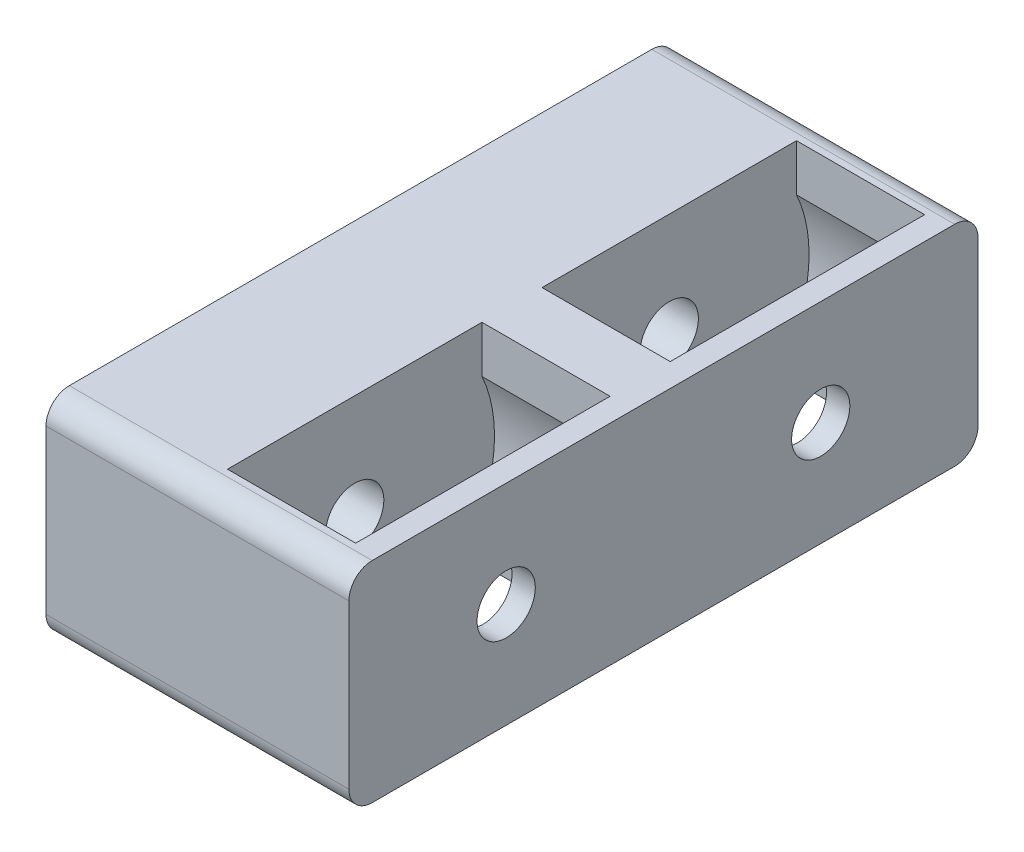
ISO-10303-21;
HEADER;
FILE_DESCRIPTION(('STEP AP214'),'2;1');
FILE_NAME('part.step','',(''),(''),'','','');
FILE_SCHEMA(('AUTOMOTIVE_DESIGN { 1 0 10303 214 1 1 1 1 }'));
ENDSEC;
DATA;
#1=APPLICATION_CONTEXT('core data for automotive mechanical design processes');
#2=APPLICATION_PROTOCOL_DEFINITION('international standard','automotive_design',2000,#1);
#3=PRODUCT_CONTEXT('',#1,'mechanical');
#4=PRODUCT('Part','Part','',(#3));
#5=PRODUCT_RELATED_PRODUCT_CATEGORY('part','',(#4));
#6=PRODUCT_DEFINITION_FORMATION('','',#4);
#7=PRODUCT_DEFINITION_CONTEXT('part definition',#1,'design');
#8=PRODUCT_DEFINITION('design','',#6,#7);
#9=PRODUCT_DEFINITION_SHAPE('','',#8);
#10=(LENGTH_UNIT() NAMED_UNIT(*) SI_UNIT(.MILLI.,.METRE.));
#11=(NAMED_UNIT(*) PLANE_ANGLE_UNIT() SI_UNIT($,.RADIAN.));
#12=(NAMED_UNIT(*) SI_UNIT($,.STERADIAN.) SOLID_ANGLE_UNIT());
#13=UNCERTAINTY_MEASURE_WITH_UNIT(LENGTH_MEASURE(1.E-05),#10,'distance_accuracy_value','');
#14=(GEOMETRIC_REPRESENTATION_CONTEXT(3) GLOBAL_UNCERTAINTY_ASSIGNED_CONTEXT((#13)) GLOBAL_UNIT_ASSIGNED_CONTEXT((#10,
#11,#12)) REPRESENTATION_CONTEXT('',''));
#15=CARTESIAN_POINT('',(0.,0.,0.));
#16=DIRECTION('',(0.,0.,1.));
#17=DIRECTION('',(1.,0.,0.));
#18=AXIS2_PLACEMENT_3D('',#15,#16,#17);
#19=CARTESIAN_POINT('',(24.,0.,13.5));
#20=DIRECTION('',(-1.,0.,0.));
#21=DIRECTION('',(0.,0.,1.));
#22=AXIS2_PLACEMENT_3D('',#19,#20,#21);
#23=CYLINDRICAL_SURFACE('',#22,2.5);
#24=CARTESIAN_POINT('',(0.,0.,13.5));
#25=DIRECTION('',(1.,0.,0.));
#26=DIRECTION('',(0.,0.,-1.));
#27=AXIS2_PLACEMENT_3D('',#24,#25,#26);
#28=CIRCLE('',#27,2.5);
#29=CARTESIAN_POINT('',(0.,0.,11.));
#30=VERTEX_POINT('',#29);
#31=EDGE_CURVE('E376',#30,#30,#28,.T.);
#32=ORIENTED_EDGE('',*,*,#31,.F.);
#33=EDGE_LOOP('',(#32));
#34=FACE_BOUND('',#33,.T.);
#35=CARTESIAN_POINT('',(13.,0.,13.5));
#36=DIRECTION('',(1.,0.,0.));
#37=DIRECTION('',(0.,0.,-1.));
#38=AXIS2_PLACEMENT_3D('',#35,#36,#37);
#39=CIRCLE('',#38,2.5);
#40=CARTESIAN_POINT('',(13.,0.,11.));
#41=VERTEX_POINT('',#40);
#42=EDGE_CURVE('E37',#41,#41,#39,.T.);
#43=ORIENTED_EDGE('',*,*,#42,.T.);
#44=EDGE_LOOP('',(#43));
#45=FACE_BOUND('',#44,.T.);
#46=ADVANCED_FACE('F33',(#34,#45),#23,.F.);
#47=CARTESIAN_POINT('',(24.,0.,-13.5));
#48=DIRECTION('',(-1.,0.,0.));
#49=DIRECTION('',(0.,0.,1.));
#50=AXIS2_PLACEMENT_3D('',#47,#48,#49);
#51=CYLINDRICAL_SURFACE('',#50,2.5);
#52=CARTESIAN_POINT('',(0.,0.,-13.5));
#53=DIRECTION('',(1.,0.,0.));
#54=DIRECTION('',(0.,0.,-1.));
#55=AXIS2_PLACEMENT_3D('',#52,#53,#54);
#56=CIRCLE('',#55,2.5);
#57=CARTESIAN_POINT('',(0.,0.,-16.));
#58=VERTEX_POINT('',#57);
#59=EDGE_CURVE('E373',#58,#58,#56,.T.);
#60=ORIENTED_EDGE('',*,*,#59,.F.);
#61=EDGE_LOOP('',(#60));
#62=FACE_BOUND('',#61,.T.);
#63=CARTESIAN_POINT('',(13.,0.,-13.5));
#64=DIRECTION('',(1.,0.,0.));
#65=DIRECTION('',(0.,0.,-1.));
#66=AXIS2_PLACEMENT_3D('',#63,#64,#65);
#67=CIRCLE('',#66,2.5);
#68=CARTESIAN_POINT('',(13.,0.,-16.));
#69=VERTEX_POINT('',#68);
#70=EDGE_CURVE('E293',#69,#69,#67,.T.);
#71=ORIENTED_EDGE('',*,*,#70,.T.);
#72=EDGE_LOOP('',(#71));
#73=FACE_BOUND('',#72,.T.);
#74=ADVANCED_FACE('F463',(#62,#73),#51,.F.);
#75=CARTESIAN_POINT('',(0.,-7.,25.));
#76=DIRECTION('',(1.,0.,0.));
#77=DIRECTION('',(0.,0.,-1.));
#78=AXIS2_PLACEMENT_3D('',#75,#76,#77);
#79=PLANE('',#78);
#80=CARTESIAN_POINT('',(0.,-7.,25.));
#81=DIRECTION('',(1.,0.,0.));
#82=DIRECTION('',(0.,0.,-1.));
#83=AXIS2_PLACEMENT_3D('',#80,#81,#82);
#84=CIRCLE('',#83,2.);
#85=CARTESIAN_POINT('',(0.,-7.,27.));
#86=VERTEX_POINT('',#85);
#87=CARTESIAN_POINT('',(0.,-9.,25.));
#88=VERTEX_POINT('',#87);
#89=EDGE_CURVE('E205',#86,#88,#84,.T.);
#90=ORIENTED_EDGE('',*,*,#89,.F.);
#91=DIRECTION('',(0.,-1.,0.));
#92=VECTOR('',#91,1.);
#93=CARTESIAN_POINT('',(0.,7.,27.));
#94=LINE('',#93,#92);
#95=CARTESIAN_POINT('',(0.,7.,27.));
#96=VERTEX_POINT('',#95);
#97=EDGE_CURVE('E392',#96,#86,#94,.T.);
#98=ORIENTED_EDGE('',*,*,#97,.F.);
#99=CARTESIAN_POINT('',(0.,7.,25.));
#100=DIRECTION('',(1.,0.,0.));
#101=DIRECTION('',(0.,0.,-1.));
#102=AXIS2_PLACEMENT_3D('',#99,#100,#101);
#103=CIRCLE('',#102,2.);
#104=CARTESIAN_POINT('',(0.,9.,25.));
#105=VERTEX_POINT('',#104);
#106=EDGE_CURVE('E390',#105,#96,#103,.T.);
#107=ORIENTED_EDGE('',*,*,#106,.F.);
#108=DIRECTION('',(0.,0.,1.));
#109=VECTOR('',#108,1.);
#110=CARTESIAN_POINT('',(0.,9.,25.));
#111=LINE('',#110,#109);
#112=CARTESIAN_POINT('',(0.,9.,-25.));
#113=VERTEX_POINT('',#112);
#114=EDGE_CURVE('E388',#113,#105,#111,.T.);
#115=ORIENTED_EDGE('',*,*,#114,.F.);
#116=CARTESIAN_POINT('',(0.,7.,-25.));
#117=DIRECTION('',(1.,0.,0.));
#118=DIRECTION('',(0.,0.,1.));
#119=AXIS2_PLACEMENT_3D('',#116,#117,#118);
#120=CIRCLE('',#119,2.);
#121=CARTESIAN_POINT('',(0.,7.,-27.));
#122=VERTEX_POINT('',#121);
#123=EDGE_CURVE('E386',#122,#113,#120,.T.);
#124=ORIENTED_EDGE('',*,*,#123,.F.);
#125=DIRECTION('',(0.,1.,0.));
#126=VECTOR('',#125,1.);
#127=CARTESIAN_POINT('',(0.,7.,-27.));
#128=LINE('',#127,#126);
#129=CARTESIAN_POINT('',(0.,-7.,-27.));
#130=VERTEX_POINT('',#129);
#131=EDGE_CURVE('E384',#130,#122,#128,.T.);
#132=ORIENTED_EDGE('',*,*,#131,.F.);
#133=CARTESIAN_POINT('',(0.,-7.,-25.));
#134=DIRECTION('',(1.,0.,0.));
#135=DIRECTION('',(0.,0.,-1.));
#136=AXIS2_PLACEMENT_3D('',#133,#134,#135);
#137=CIRCLE('',#136,2.);
#138=CARTESIAN_POINT('',(0.,-9.,-25.));
#139=VERTEX_POINT('',#138);
#140=EDGE_CURVE('E382',#139,#130,#137,.T.);
#141=ORIENTED_EDGE('',*,*,#140,.F.);
#142=DIRECTION('',(0.,0.,-1.));
#143=VECTOR('',#142,1.);
#144=CARTESIAN_POINT('',(0.,-9.,25.));
#145=LINE('',#144,#143);
#146=EDGE_CURVE('E380',#88,#139,#145,.T.);
#147=ORIENTED_EDGE('',*,*,#146,.F.);
#148=EDGE_LOOP('',(#90,#98,#107,#115,#124,#132,#141,#147));
#149=FACE_BOUND('',#148,.T.);
#150=ORIENTED_EDGE('',*,*,#31,.T.);
#151=EDGE_LOOP('',(#150));
#152=FACE_BOUND('',#151,.T.);
#153=ORIENTED_EDGE('',*,*,#59,.T.);
#154=EDGE_LOOP('',(#153));
#155=FACE_BOUND('',#154,.T.);
#156=ADVANCED_FACE('F469',(#149,#152,#155),#79,.F.);
#157=CARTESIAN_POINT('',(24.,-7.,25.));
#158=DIRECTION('',(-1.,0.,0.));
#159=DIRECTION('',(0.,0.,1.));
#160=AXIS2_PLACEMENT_3D('',#157,#158,#159);
#161=CYLINDRICAL_SURFACE('',#160,2.);
#162=ORIENTED_EDGE('',*,*,#89,.T.);
#163=DIRECTION('',(-1.,0.,0.));
#164=VECTOR('',#163,1.);
#165=CARTESIAN_POINT('',(24.,-9.,25.));
#166=LINE('',#165,#164);
#167=CARTESIAN_POINT('',(26.,-9.,25.));
#168=VERTEX_POINT('',#167);
#169=EDGE_CURVE('E11',#168,#88,#166,.T.);
#170=ORIENTED_EDGE('',*,*,#169,.F.);
#171=CARTESIAN_POINT('',(26.,-7.,25.));
#172=DIRECTION('',(1.,0.,0.));
#173=DIRECTION('',(0.,0.,-1.));
#174=AXIS2_PLACEMENT_3D('',#171,#172,#173);
#175=CIRCLE('',#174,2.);
#176=CARTESIAN_POINT('',(26.,-7.,27.));
#177=VERTEX_POINT('',#176);
#178=EDGE_CURVE('E203',#177,#168,#175,.T.);
#179=ORIENTED_EDGE('',*,*,#178,.F.);
#180=DIRECTION('',(-1.,0.,0.));
#181=VECTOR('',#180,1.);
#182=CARTESIAN_POINT('',(24.,-7.,27.));
#183=LINE('',#182,#181);
#184=EDGE_CURVE('E394',#177,#86,#183,.T.);
#185=ORIENTED_EDGE('',*,*,#184,.T.);
#186=EDGE_LOOP('',(#162,#170,#179,#185));
#187=FACE_BOUND('',#186,.T.);
#188=ADVANCED_FACE('F35',(#187),#161,.T.);
#189=CARTESIAN_POINT('',(24.,-9.,25.));
#190=DIRECTION('',(0.,1.,0.));
#191=DIRECTION('',(0.,0.,1.));
#192=AXIS2_PLACEMENT_3D('',#189,#190,#191);
#193=PLANE('',#192);
#194=DIRECTION('',(1.,0.,0.));
#195=VECTOR('',#194,1.);
#196=CARTESIAN_POINT('',(13.,-9.,24.4208607069686));
#197=LINE('',#196,#195);
#198=CARTESIAN_POINT('',(13.,-9.,24.4208607069686));
#199=VERTEX_POINT('',#198);
#200=CARTESIAN_POINT('',(24.,-9.,24.4208607069686));
#201=VERTEX_POINT('',#200);
#202=EDGE_CURVE('E297',#199,#201,#197,.T.);
#203=ORIENTED_EDGE('',*,*,#202,.T.);
#204=DIRECTION('',(0.,0.,-1.));
#205=VECTOR('',#204,1.);
#206=CARTESIAN_POINT('',(24.,-9.,25.));
#207=LINE('',#206,#205);
#208=CARTESIAN_POINT('',(24.,-9.,2.57913929303135));
#209=VERTEX_POINT('',#208);
#210=EDGE_CURVE('E247',#201,#209,#207,.T.);
#211=ORIENTED_EDGE('',*,*,#210,.T.);
#212=DIRECTION('',(1.,0.,0.));
#213=VECTOR('',#212,1.);
#214=CARTESIAN_POINT('',(13.,-9.,2.57913929303135));
#215=LINE('',#214,#213);
#216=CARTESIAN_POINT('',(13.,-9.,2.57913929303135));
#217=VERTEX_POINT('',#216);
#218=EDGE_CURVE('E294',#217,#209,#215,.T.);
#219=ORIENTED_EDGE('',*,*,#218,.F.);
#220=DIRECTION('',(0.,0.,-1.));
#221=VECTOR('',#220,1.);
#222=CARTESIAN_POINT('',(13.,-9.,24.4208607069686));
#223=LINE('',#222,#221);
#224=EDGE_CURVE('E266',#199,#217,#223,.T.);
#225=ORIENTED_EDGE('',*,*,#224,.F.);
#226=EDGE_LOOP('',(#203,#211,#219,#225));
#227=FACE_BOUND('',#226,.T.);
#228=DIRECTION('',(1.,0.,0.));
#229=VECTOR('',#228,1.);
#230=CARTESIAN_POINT('',(13.,-9.,-2.57913929303136));
#231=LINE('',#230,#229);
#232=CARTESIAN_POINT('',(13.,-9.,-2.57913929303136));
#233=VERTEX_POINT('',#232);
#234=CARTESIAN_POINT('',(24.,-9.,-2.57913929303136));
#235=VERTEX_POINT('',#234);
#236=EDGE_CURVE('E356',#233,#235,#231,.T.);
#237=ORIENTED_EDGE('',*,*,#236,.T.);
#238=CARTESIAN_POINT('',(24.,-9.,-24.4208607069686));
#239=VERTEX_POINT('',#238);
#240=EDGE_CURVE('E245',#235,#239,#207,.T.);
#241=ORIENTED_EDGE('',*,*,#240,.T.);
#242=DIRECTION('',(1.,0.,0.));
#243=VECTOR('',#242,1.);
#244=CARTESIAN_POINT('',(13.,-9.,-24.4208607069686));
#245=LINE('',#244,#243);
#246=CARTESIAN_POINT('',(13.,-9.,-24.4208607069686));
#247=VERTEX_POINT('',#246);
#248=EDGE_CURVE('E353',#247,#239,#245,.T.);
#249=ORIENTED_EDGE('',*,*,#248,.F.);
#250=DIRECTION('',(0.,0.,-1.));
#251=VECTOR('',#250,1.);
#252=CARTESIAN_POINT('',(13.,-9.,-2.57913929303136));
#253=LINE('',#252,#251);
#254=EDGE_CURVE('E329',#233,#247,#253,.T.);
#255=ORIENTED_EDGE('',*,*,#254,.F.);
#256=EDGE_LOOP('',(#237,#241,#249,#255));
#257=FACE_BOUND('',#256,.T.);
#258=DIRECTION('',(0.,0.,-1.));
#259=VECTOR('',#258,1.);
#260=CARTESIAN_POINT('',(26.,-9.,25.));
#261=LINE('',#260,#259);
#262=CARTESIAN_POINT('',(26.,-9.,-25.));
#263=VERTEX_POINT('',#262);
#264=EDGE_CURVE('E208',#168,#263,#261,.T.);
#265=ORIENTED_EDGE('',*,*,#264,.F.);
#266=ORIENTED_EDGE('',*,*,#169,.T.);
#267=ORIENTED_EDGE('',*,*,#146,.T.);
#268=DIRECTION('',(-1.,0.,0.));
#269=VECTOR('',#268,1.);
#270=CARTESIAN_POINT('',(24.,-9.,-25.));
#271=LINE('',#270,#269);
#272=EDGE_CURVE('E42',#263,#139,#271,.T.);
#273=ORIENTED_EDGE('',*,*,#272,.F.);
#274=EDGE_LOOP('',(#265,#266,#267,#273));
#275=FACE_BOUND('',#274,.T.);
#276=ADVANCED_FACE('F209',(#227,#257,#275),#193,.F.);
#277=CARTESIAN_POINT('',(24.,-7.,-25.));
#278=DIRECTION('',(-1.,0.,0.));
#279=DIRECTION('',(0.,0.,1.));
#280=AXIS2_PLACEMENT_3D('',#277,#278,#279);
#281=CYLINDRICAL_SURFACE('',#280,2.);
#282=ORIENTED_EDGE('',*,*,#140,.T.);
#283=DIRECTION('',(-1.,0.,0.));
#284=VECTOR('',#283,1.);
#285=CARTESIAN_POINT('',(24.,-7.,-27.));
#286=LINE('',#285,#284);
#287=CARTESIAN_POINT('',(26.,-7.,-27.));
#288=VERTEX_POINT('',#287);
#289=EDGE_CURVE('E408',#288,#130,#286,.T.);
#290=ORIENTED_EDGE('',*,*,#289,.F.);
#291=CARTESIAN_POINT('',(26.,-7.,-25.));
#292=DIRECTION('',(1.,0.,0.));
#293=DIRECTION('',(0.,0.,-1.));
#294=AXIS2_PLACEMENT_3D('',#291,#292,#293);
#295=CIRCLE('',#294,2.);
#296=EDGE_CURVE('E214',#263,#288,#295,.T.);
#297=ORIENTED_EDGE('',*,*,#296,.F.);
#298=ORIENTED_EDGE('',*,*,#272,.T.);
#299=EDGE_LOOP('',(#282,#290,#297,#298));
#300=FACE_BOUND('',#299,.T.);
#301=ADVANCED_FACE('F497',(#300),#281,.T.);
#302=CARTESIAN_POINT('',(24.,7.,-27.));
#303=DIRECTION('',(0.,0.,1.));
#304=DIRECTION('',(0.,-1.,0.));
#305=AXIS2_PLACEMENT_3D('',#302,#303,#304);
#306=PLANE('',#305);
#307=ORIENTED_EDGE('',*,*,#131,.T.);
#308=DIRECTION('',(-1.,0.,0.));
#309=VECTOR('',#308,1.);
#310=CARTESIAN_POINT('',(24.,7.,-27.));
#311=LINE('',#310,#309);
#312=CARTESIAN_POINT('',(26.,7.,-27.));
#313=VERTEX_POINT('',#312);
#314=EDGE_CURVE('E405',#313,#122,#311,.T.);
#315=ORIENTED_EDGE('',*,*,#314,.F.);
#316=DIRECTION('',(0.,1.,0.));
#317=VECTOR('',#316,1.);
#318=CARTESIAN_POINT('',(26.,7.,-27.));
#319=LINE('',#318,#317);
#320=EDGE_CURVE('E232',#288,#313,#319,.T.);
#321=ORIENTED_EDGE('',*,*,#320,.F.);
#322=ORIENTED_EDGE('',*,*,#289,.T.);
#323=EDGE_LOOP('',(#307,#315,#321,#322));
#324=FACE_BOUND('',#323,.T.);
#325=ADVANCED_FACE('F493',(#324),#306,.F.);
#326=CARTESIAN_POINT('',(24.,7.,-25.));
#327=DIRECTION('',(-1.,0.,0.));
#328=DIRECTION('',(0.,0.,1.));
#329=AXIS2_PLACEMENT_3D('',#326,#327,#328);
#330=CYLINDRICAL_SURFACE('',#329,2.);
#331=ORIENTED_EDGE('',*,*,#123,.T.);
#332=DIRECTION('',(-1.,0.,0.));
#333=VECTOR('',#332,1.);
#334=CARTESIAN_POINT('',(24.,9.,-25.));
#335=LINE('',#334,#333);
#336=CARTESIAN_POINT('',(26.,9.,-25.));
#337=VERTEX_POINT('',#336);
#338=EDGE_CURVE('E402',#337,#113,#335,.T.);
#339=ORIENTED_EDGE('',*,*,#338,.F.);
#340=CARTESIAN_POINT('',(26.,7.,-25.));
#341=DIRECTION('',(1.,0.,0.));
#342=DIRECTION('',(0.,0.,1.));
#343=AXIS2_PLACEMENT_3D('',#340,#341,#342);
#344=CIRCLE('',#343,2.);
#345=EDGE_CURVE('E235',#313,#337,#344,.T.);
#346=ORIENTED_EDGE('',*,*,#345,.F.);
#347=ORIENTED_EDGE('',*,*,#314,.T.);
#348=EDGE_LOOP('',(#331,#339,#346,#347));
#349=FACE_BOUND('',#348,.T.);
#350=ADVANCED_FACE('F489',(#349),#330,.T.);
#351=CARTESIAN_POINT('',(24.,9.,25.));
#352=DIRECTION('',(0.,-1.,0.));
#353=DIRECTION('',(0.,0.,-1.));
#354=AXIS2_PLACEMENT_3D('',#351,#352,#353);
#355=PLANE('',#354);
#356=DIRECTION('',(1.,0.,0.));
#357=VECTOR('',#356,1.);
#358=CARTESIAN_POINT('',(13.,9.,-24.4208607069686));
#359=LINE('',#358,#357);
#360=CARTESIAN_POINT('',(13.,9.,-24.4208607069686));
#361=VERTEX_POINT('',#360);
#362=CARTESIAN_POINT('',(24.,9.,-24.4208607069686));
#363=VERTEX_POINT('',#362);
#364=EDGE_CURVE('E368',#361,#363,#359,.T.);
#365=ORIENTED_EDGE('',*,*,#364,.T.);
#366=DIRECTION('',(0.,0.,1.));
#367=VECTOR('',#366,1.);
#368=CARTESIAN_POINT('',(24.,9.,25.));
#369=LINE('',#368,#367);
#370=CARTESIAN_POINT('',(24.,9.,-2.57913929303135));
#371=VERTEX_POINT('',#370);
#372=EDGE_CURVE('E222',#363,#371,#369,.T.);
#373=ORIENTED_EDGE('',*,*,#372,.T.);
#374=DIRECTION('',(1.,0.,0.));
#375=VECTOR('',#374,1.);
#376=CARTESIAN_POINT('',(13.,9.,-2.57913929303135));
#377=LINE('',#376,#375);
#378=CARTESIAN_POINT('',(13.,9.,-2.57913929303135));
#379=VERTEX_POINT('',#378);
#380=EDGE_CURVE('E365',#379,#371,#377,.T.);
#381=ORIENTED_EDGE('',*,*,#380,.F.);
#382=DIRECTION('',(0.,0.,1.));
#383=VECTOR('',#382,1.);
#384=CARTESIAN_POINT('',(13.,9.,-24.4208607069686));
#385=LINE('',#384,#383);
#386=EDGE_CURVE('E318',#361,#379,#385,.T.);
#387=ORIENTED_EDGE('',*,*,#386,.F.);
#388=EDGE_LOOP('',(#365,#373,#381,#387));
#389=FACE_BOUND('',#388,.T.);
#390=DIRECTION('',(1.,0.,0.));
#391=VECTOR('',#390,1.);
#392=CARTESIAN_POINT('',(13.,9.,2.57913929303135));
#393=LINE('',#392,#391);
#394=CARTESIAN_POINT('',(13.,9.,2.57913929303135));
#395=VERTEX_POINT('',#394);
#396=CARTESIAN_POINT('',(24.,9.,2.57913929303135));
#397=VERTEX_POINT('',#396);
#398=EDGE_CURVE('E309',#395,#397,#393,.T.);
#399=ORIENTED_EDGE('',*,*,#398,.T.);
#400=CARTESIAN_POINT('',(24.,9.,24.4208607069686));
#401=VERTEX_POINT('',#400);
#402=EDGE_CURVE('E225',#397,#401,#369,.T.);
#403=ORIENTED_EDGE('',*,*,#402,.T.);
#404=DIRECTION('',(1.,0.,0.));
#405=VECTOR('',#404,1.);
#406=CARTESIAN_POINT('',(13.,9.,24.4208607069686));
#407=LINE('',#406,#405);
#408=CARTESIAN_POINT('',(13.,9.,24.4208607069686));
#409=VERTEX_POINT('',#408);
#410=EDGE_CURVE('E306',#409,#401,#407,.T.);
#411=ORIENTED_EDGE('',*,*,#410,.F.);
#412=DIRECTION('',(0.,0.,1.));
#413=VECTOR('',#412,1.);
#414=CARTESIAN_POINT('',(13.,9.,2.57913929303135));
#415=LINE('',#414,#413);
#416=EDGE_CURVE('E255',#395,#409,#415,.T.);
#417=ORIENTED_EDGE('',*,*,#416,.F.);
#418=EDGE_LOOP('',(#399,#403,#411,#417));
#419=FACE_BOUND('',#418,.T.);
#420=DIRECTION('',(-1.,0.,0.));
#421=VECTOR('',#420,1.);
#422=CARTESIAN_POINT('',(24.,9.,25.));
#423=LINE('',#422,#421);
#424=CARTESIAN_POINT('',(26.,8.99999999999999,25.));
#425=VERTEX_POINT('',#424);
#426=EDGE_CURVE('E399',#425,#105,#423,.T.);
#427=ORIENTED_EDGE('',*,*,#426,.F.);
#428=DIRECTION('',(0.,0.,1.));
#429=VECTOR('',#428,1.);
#430=CARTESIAN_POINT('',(26.,9.,25.));
#431=LINE('',#430,#429);
#432=EDGE_CURVE('E238',#337,#425,#431,.T.);
#433=ORIENTED_EDGE('',*,*,#432,.F.);
#434=ORIENTED_EDGE('',*,*,#338,.T.);
#435=ORIENTED_EDGE('',*,*,#114,.T.);
#436=EDGE_LOOP('',(#427,#433,#434,#435));
#437=FACE_BOUND('',#436,.T.);
#438=ADVANCED_FACE('F431',(#389,#419,#437),#355,.F.);
#439=CARTESIAN_POINT('',(24.,7.,25.));
#440=DIRECTION('',(-1.,0.,0.));
#441=DIRECTION('',(0.,0.,1.));
#442=AXIS2_PLACEMENT_3D('',#439,#440,#441);
#443=CYLINDRICAL_SURFACE('',#442,2.);
#444=ORIENTED_EDGE('',*,*,#106,.T.);
#445=DIRECTION('',(-1.,0.,0.));
#446=VECTOR('',#445,1.);
#447=CARTESIAN_POINT('',(24.,7.,27.));
#448=LINE('',#447,#446);
#449=CARTESIAN_POINT('',(26.,7.,27.));
#450=VERTEX_POINT('',#449);
#451=EDGE_CURVE('E396',#450,#96,#448,.T.);
#452=ORIENTED_EDGE('',*,*,#451,.F.);
#453=CARTESIAN_POINT('',(26.,7.,25.));
#454=DIRECTION('',(1.,0.,0.));
#455=DIRECTION('',(0.,0.,-1.));
#456=AXIS2_PLACEMENT_3D('',#453,#454,#455);
#457=CIRCLE('',#456,2.);
#458=EDGE_CURVE('E241',#425,#450,#457,.T.);
#459=ORIENTED_EDGE('',*,*,#458,.F.);
#460=ORIENTED_EDGE('',*,*,#426,.T.);
#461=EDGE_LOOP('',(#444,#452,#459,#460));
#462=FACE_BOUND('',#461,.T.);
#463=ADVANCED_FACE('F482',(#462),#443,.T.);
#464=CARTESIAN_POINT('',(24.,7.,27.));
#465=DIRECTION('',(0.,0.,-1.));
#466=DIRECTION('',(0.,1.,0.));
#467=AXIS2_PLACEMENT_3D('',#464,#465,#466);
#468=PLANE('',#467);
#469=ORIENTED_EDGE('',*,*,#97,.T.);
#470=ORIENTED_EDGE('',*,*,#184,.F.);
#471=DIRECTION('',(0.,-1.,0.));
#472=VECTOR('',#471,1.);
#473=CARTESIAN_POINT('',(26.,7.,27.));
#474=LINE('',#473,#472);
#475=EDGE_CURVE('E221',#450,#177,#474,.T.);
#476=ORIENTED_EDGE('',*,*,#475,.F.);
#477=ORIENTED_EDGE('',*,*,#451,.T.);
#478=EDGE_LOOP('',(#469,#470,#476,#477));
#479=FACE_BOUND('',#478,.T.);
#480=ADVANCED_FACE('F478',(#479),#468,.F.);
#481=CARTESIAN_POINT('',(13.,0.,-13.5));
#482=DIRECTION('',(1.,0.,0.));
#483=DIRECTION('',(0.,0.,-1.));
#484=AXIS2_PLACEMENT_3D('',#481,#482,#483);
#485=CYLINDRICAL_SURFACE('',#484,12.);
#486=CARTESIAN_POINT('',(24.,0.,-13.5));
#487=DIRECTION('',(1.,0.,0.));
#488=DIRECTION('',(0.,0.,-1.));
#489=AXIS2_PLACEMENT_3D('',#486,#487,#488);
#490=CIRCLE('',#489,12.);
#491=CARTESIAN_POINT('',(24.,-4.97340943608993,-24.4208607069686));
#492=VERTEX_POINT('',#491);
#493=CARTESIAN_POINT('',(24.,4.97340943608993,-24.4208607069686));
#494=VERTEX_POINT('',#493);
#495=EDGE_CURVE('E244',#492,#494,#490,.T.);
#496=ORIENTED_EDGE('',*,*,#495,.T.);
#497=DIRECTION('',(1.,0.,0.));
#498=VECTOR('',#497,1.);
#499=CARTESIAN_POINT('',(13.,4.97340943608993,-24.4208607069686));
#500=LINE('',#499,#498);
#501=CARTESIAN_POINT('',(13.,4.97340943608993,-24.4208607069686));
#502=VERTEX_POINT('',#501);
#503=EDGE_CURVE('E334',#502,#494,#500,.T.);
#504=ORIENTED_EDGE('',*,*,#503,.F.);
#505=CARTESIAN_POINT('',(13.,0.,-13.5));
#506=DIRECTION('',(1.,0.,0.));
#507=DIRECTION('',(0.,0.,-1.));
#508=AXIS2_PLACEMENT_3D('',#505,#506,#507);
#509=CIRCLE('',#508,12.);
#510=CARTESIAN_POINT('',(13.,-4.97340943608993,-24.4208607069686));
#511=VERTEX_POINT('',#510);
#512=EDGE_CURVE('E314',#511,#502,#509,.T.);
#513=ORIENTED_EDGE('',*,*,#512,.F.);
#514=DIRECTION('',(1.,0.,0.));
#515=VECTOR('',#514,1.);
#516=CARTESIAN_POINT('',(13.,-4.97340943608993,-24.4208607069686));
#517=LINE('',#516,#515);
#518=EDGE_CURVE('E276',#511,#492,#517,.T.);
#519=ORIENTED_EDGE('',*,*,#518,.T.);
#520=EDGE_LOOP('',(#496,#504,#513,#519));
#521=FACE_BOUND('',#520,.T.);
#522=ADVANCED_FACE('F481',(#521),#485,.F.);
#523=CARTESIAN_POINT('',(13.,-4.97340943608993,-24.4208607069686));
#524=DIRECTION('',(0.,0.,-1.));
#525=DIRECTION('',(-1.,0.,0.));
#526=AXIS2_PLACEMENT_3D('',#523,#524,#525);
#527=PLANE('',#526);
#528=DIRECTION('',(0.,1.,0.));
#529=VECTOR('',#528,1.);
#530=CARTESIAN_POINT('',(24.,-4.97340943608993,-24.4208607069686));
#531=LINE('',#530,#529);
#532=EDGE_CURVE('E316',#239,#492,#531,.T.);
#533=ORIENTED_EDGE('',*,*,#532,.T.);
#534=ORIENTED_EDGE('',*,*,#518,.F.);
#535=DIRECTION('',(0.,1.,0.));
#536=VECTOR('',#535,1.);
#537=CARTESIAN_POINT('',(13.,-4.97340943608993,-24.4208607069686));
#538=LINE('',#537,#536);
#539=EDGE_CURVE('E331',#247,#511,#538,.T.);
#540=ORIENTED_EDGE('',*,*,#539,.F.);
#541=ORIENTED_EDGE('',*,*,#248,.T.);
#542=EDGE_LOOP('',(#533,#534,#540,#541));
#543=FACE_BOUND('',#542,.T.);
#544=ADVANCED_FACE('F607',(#543),#527,.F.);
#545=CARTESIAN_POINT('',(13.,-9.,-2.57913929303136));
#546=DIRECTION('',(0.,0.,1.));
#547=DIRECTION('',(0.,-1.,0.));
#548=AXIS2_PLACEMENT_3D('',#545,#546,#547);
#549=PLANE('',#548);
#550=DIRECTION('',(0.,-1.,0.));
#551=VECTOR('',#550,1.);
#552=CARTESIAN_POINT('',(24.,-9.,-2.57913929303136));
#553=LINE('',#552,#551);
#554=CARTESIAN_POINT('',(24.,-4.97340943608993,-2.57913929303135));
#555=VERTEX_POINT('',#554);
#556=EDGE_CURVE('E346',#555,#235,#553,.T.);
#557=ORIENTED_EDGE('',*,*,#556,.T.);
#558=ORIENTED_EDGE('',*,*,#236,.F.);
#559=DIRECTION('',(0.,-1.,0.));
#560=VECTOR('',#559,1.);
#561=CARTESIAN_POINT('',(13.,-9.,-2.57913929303136));
#562=LINE('',#561,#560);
#563=CARTESIAN_POINT('',(13.,-4.97340943608993,-2.57913929303135));
#564=VERTEX_POINT('',#563);
#565=EDGE_CURVE('E326',#564,#233,#562,.T.);
#566=ORIENTED_EDGE('',*,*,#565,.F.);
#567=DIRECTION('',(1.,0.,0.));
#568=VECTOR('',#567,1.);
#569=CARTESIAN_POINT('',(13.,-4.97340943608993,-2.57913929303135));
#570=LINE('',#569,#568);
#571=EDGE_CURVE('E359',#564,#555,#570,.T.);
#572=ORIENTED_EDGE('',*,*,#571,.T.);
#573=EDGE_LOOP('',(#557,#558,#566,#572));
#574=FACE_BOUND('',#573,.T.);
#575=ADVANCED_FACE('F602',(#574),#549,.F.);
#576=CARTESIAN_POINT('',(13.,0.,-13.5));
#577=DIRECTION('',(1.,0.,0.));
#578=DIRECTION('',(0.,0.,-1.));
#579=AXIS2_PLACEMENT_3D('',#576,#577,#578);
#580=CYLINDRICAL_SURFACE('',#579,12.);
#581=CARTESIAN_POINT('',(24.,0.,-13.5));
#582=DIRECTION('',(1.,0.,0.));
#583=DIRECTION('',(0.,0.,-1.));
#584=AXIS2_PLACEMENT_3D('',#581,#582,#583);
#585=CIRCLE('',#584,12.);
#586=CARTESIAN_POINT('',(24.,4.97340943608993,-2.57913929303135));
#587=VERTEX_POINT('',#586);
#588=EDGE_CURVE('E343',#587,#555,#585,.T.);
#589=ORIENTED_EDGE('',*,*,#588,.T.);
#590=ORIENTED_EDGE('',*,*,#571,.F.);
#591=CARTESIAN_POINT('',(13.,0.,-13.5));
#592=DIRECTION('',(1.,0.,0.));
#593=DIRECTION('',(0.,0.,-1.));
#594=AXIS2_PLACEMENT_3D('',#591,#592,#593);
#595=CIRCLE('',#594,12.);
#596=CARTESIAN_POINT('',(13.,4.97340943608993,-2.57913929303135));
#597=VERTEX_POINT('',#596);
#598=EDGE_CURVE('E323',#597,#564,#595,.T.);
#599=ORIENTED_EDGE('',*,*,#598,.F.);
#600=DIRECTION('',(1.,0.,0.));
#601=VECTOR('',#600,1.);
#602=CARTESIAN_POINT('',(13.,4.97340943608993,-2.57913929303135));
#603=LINE('',#602,#601);
#604=EDGE_CURVE('E362',#597,#587,#603,.T.);
#605=ORIENTED_EDGE('',*,*,#604,.T.);
#606=EDGE_LOOP('',(#589,#590,#599,#605));
#607=FACE_BOUND('',#606,.T.);
#608=ADVANCED_FACE('F617',(#607),#580,.F.);
#609=CARTESIAN_POINT('',(13.,9.,-2.57913929303135));
#610=DIRECTION('',(0.,0.,1.));
#611=DIRECTION('',(0.,-1.,0.));
#612=AXIS2_PLACEMENT_3D('',#609,#610,#611);
#613=PLANE('',#612);
#614=DIRECTION('',(0.,-1.,0.));
#615=VECTOR('',#614,1.);
#616=CARTESIAN_POINT('',(24.,9.,-2.57913929303135));
#617=LINE('',#616,#615);
#618=EDGE_CURVE('E340',#371,#587,#617,.T.);
#619=ORIENTED_EDGE('',*,*,#618,.T.);
#620=ORIENTED_EDGE('',*,*,#604,.F.);
#621=DIRECTION('',(0.,-1.,0.));
#622=VECTOR('',#621,1.);
#623=CARTESIAN_POINT('',(13.,9.,-2.57913929303135));
#624=LINE('',#623,#622);
#625=EDGE_CURVE('E320',#379,#597,#624,.T.);
#626=ORIENTED_EDGE('',*,*,#625,.F.);
#627=ORIENTED_EDGE('',*,*,#380,.T.);
#628=EDGE_LOOP('',(#619,#620,#626,#627));
#629=FACE_BOUND('',#628,.T.);
#630=ADVANCED_FACE('F615',(#629),#613,.F.);
#631=CARTESIAN_POINT('',(13.,9.,-24.4208607069686));
#632=DIRECTION('',(0.,0.,-1.));
#633=DIRECTION('',(-1.,0.,0.));
#634=AXIS2_PLACEMENT_3D('',#631,#632,#633);
#635=PLANE('',#634);
#636=DIRECTION('',(0.,1.,0.));
#637=VECTOR('',#636,1.);
#638=CARTESIAN_POINT('',(24.,9.,-24.4208607069686));
#639=LINE('',#638,#637);
#640=EDGE_CURVE('E337',#494,#363,#639,.T.);
#641=ORIENTED_EDGE('',*,*,#640,.T.);
#642=ORIENTED_EDGE('',*,*,#364,.F.);
#643=DIRECTION('',(0.,1.,0.));
#644=VECTOR('',#643,1.);
#645=CARTESIAN_POINT('',(13.,9.,-24.4208607069686));
#646=LINE('',#645,#644);
#647=EDGE_CURVE('E58',#502,#361,#646,.T.);
#648=ORIENTED_EDGE('',*,*,#647,.F.);
#649=ORIENTED_EDGE('',*,*,#503,.T.);
#650=EDGE_LOOP('',(#641,#642,#648,#649));
#651=FACE_BOUND('',#650,.T.);
#652=ADVANCED_FACE('F528',(#651),#635,.F.);
#653=CARTESIAN_POINT('',(13.,0.,-13.5));
#654=DIRECTION('',(1.,0.,0.));
#655=DIRECTION('',(0.,0.,-1.));
#656=AXIS2_PLACEMENT_3D('',#653,#654,#655);
#657=PLANE('',#656);
#658=ORIENTED_EDGE('',*,*,#70,.F.);
#659=EDGE_LOOP('',(#658));
#660=FACE_BOUND('',#659,.T.);
#661=ORIENTED_EDGE('',*,*,#512,.T.);
#662=ORIENTED_EDGE('',*,*,#647,.T.);
#663=ORIENTED_EDGE('',*,*,#386,.T.);
#664=ORIENTED_EDGE('',*,*,#625,.T.);
#665=ORIENTED_EDGE('',*,*,#598,.T.);
#666=ORIENTED_EDGE('',*,*,#565,.T.);
#667=ORIENTED_EDGE('',*,*,#254,.T.);
#668=ORIENTED_EDGE('',*,*,#539,.T.);
#669=EDGE_LOOP('',(#661,#662,#663,#664,#665,#666,#667,#668));
#670=FACE_BOUND('',#669,.T.);
#671=ADVANCED_FACE('F524',(#660,#670),#657,.T.);
#672=CARTESIAN_POINT('',(13.,0.,13.5));
#673=DIRECTION('',(1.,0.,0.));
#674=DIRECTION('',(0.,0.,-1.));
#675=AXIS2_PLACEMENT_3D('',#672,#673,#674);
#676=CYLINDRICAL_SURFACE('',#675,12.);
#677=CARTESIAN_POINT('',(24.,0.,13.5));
#678=DIRECTION('',(1.,0.,0.));
#679=DIRECTION('',(0.,0.,-1.));
#680=AXIS2_PLACEMENT_3D('',#677,#678,#679);
#681=CIRCLE('',#680,12.);
#682=CARTESIAN_POINT('',(24.,-4.97340943608993,2.57913929303135));
#683=VERTEX_POINT('',#682);
#684=CARTESIAN_POINT('',(24.,4.97340943608993,2.57913929303135));
#685=VERTEX_POINT('',#684);
#686=EDGE_CURVE('E272',#683,#685,#681,.T.);
#687=ORIENTED_EDGE('',*,*,#686,.T.);
#688=DIRECTION('',(1.,0.,0.));
#689=VECTOR('',#688,1.);
#690=CARTESIAN_POINT('',(13.,4.97340943608993,2.57913929303135));
#691=LINE('',#690,#689);
#692=CARTESIAN_POINT('',(13.,4.97340943608993,2.57913929303135));
#693=VERTEX_POINT('',#692);
#694=EDGE_CURVE('E271',#693,#685,#691,.T.);
#695=ORIENTED_EDGE('',*,*,#694,.F.);
#696=CARTESIAN_POINT('',(13.,0.,13.5));
#697=DIRECTION('',(1.,0.,0.));
#698=DIRECTION('',(0.,0.,-1.));
#699=AXIS2_PLACEMENT_3D('',#696,#697,#698);
#700=CIRCLE('',#699,12.);
#701=CARTESIAN_POINT('',(13.,-4.97340943608993,2.57913929303135));
#702=VERTEX_POINT('',#701);
#703=EDGE_CURVE('E251',#702,#693,#700,.T.);
#704=ORIENTED_EDGE('',*,*,#703,.F.);
#705=DIRECTION('',(1.,0.,0.));
#706=VECTOR('',#705,1.);
#707=CARTESIAN_POINT('',(13.,-4.97340943608993,2.57913929303135));
#708=LINE('',#707,#706);
#709=EDGE_CURVE('E290',#702,#683,#708,.T.);
#710=ORIENTED_EDGE('',*,*,#709,.T.);
#711=EDGE_LOOP('',(#687,#695,#704,#710));
#712=FACE_BOUND('',#711,.T.);
#713=ADVANCED_FACE('F426',(#712),#676,.F.);
#714=CARTESIAN_POINT('',(13.,-4.97340943608993,2.57913929303135));
#715=DIRECTION('',(0.,0.,-1.));
#716=DIRECTION('',(-1.,0.,0.));
#717=AXIS2_PLACEMENT_3D('',#714,#715,#716);
#718=PLANE('',#717);
#719=DIRECTION('',(0.,1.,0.));
#720=VECTOR('',#719,1.);
#721=CARTESIAN_POINT('',(24.,-4.97340943608993,2.57913929303135));
#722=LINE('',#721,#720);
#723=EDGE_CURVE('E253',#209,#683,#722,.T.);
#724=ORIENTED_EDGE('',*,*,#723,.T.);
#725=ORIENTED_EDGE('',*,*,#709,.F.);
#726=DIRECTION('',(0.,1.,0.));
#727=VECTOR('',#726,1.);
#728=CARTESIAN_POINT('',(13.,-4.97340943608993,2.57913929303135));
#729=LINE('',#728,#727);
#730=EDGE_CURVE('E268',#217,#702,#729,.T.);
#731=ORIENTED_EDGE('',*,*,#730,.F.);
#732=ORIENTED_EDGE('',*,*,#218,.T.);
#733=EDGE_LOOP('',(#724,#725,#731,#732));
#734=FACE_BOUND('',#733,.T.);
#735=ADVANCED_FACE('F447',(#734),#718,.F.);
#736=CARTESIAN_POINT('',(13.,-4.97340943608993,24.4208607069686));
#737=DIRECTION('',(0.,0.,1.));
#738=DIRECTION('',(1.,0.,0.));
#739=AXIS2_PLACEMENT_3D('',#736,#737,#738);
#740=PLANE('',#739);
#741=DIRECTION('',(0.,-1.,0.));
#742=VECTOR('',#741,1.);
#743=CARTESIAN_POINT('',(24.,-4.97340943608993,24.4208607069686));
#744=LINE('',#743,#742);
#745=CARTESIAN_POINT('',(24.,-4.97340943608993,24.4208607069686));
#746=VERTEX_POINT('',#745);
#747=EDGE_CURVE('E285',#746,#201,#744,.T.);
#748=ORIENTED_EDGE('',*,*,#747,.T.);
#749=ORIENTED_EDGE('',*,*,#202,.F.);
#750=DIRECTION('',(0.,-1.,0.));
#751=VECTOR('',#750,1.);
#752=CARTESIAN_POINT('',(13.,-4.97340943608993,24.4208607069686));
#753=LINE('',#752,#751);
#754=CARTESIAN_POINT('',(13.,-4.97340943608993,24.4208607069686));
#755=VERTEX_POINT('',#754);
#756=EDGE_CURVE('E263',#755,#199,#753,.T.);
#757=ORIENTED_EDGE('',*,*,#756,.F.);
#758=DIRECTION('',(1.,0.,0.));
#759=VECTOR('',#758,1.);
#760=CARTESIAN_POINT('',(13.,-4.97340943608993,24.4208607069686));
#761=LINE('',#760,#759);
#762=EDGE_CURVE('E300',#755,#746,#761,.T.);
#763=ORIENTED_EDGE('',*,*,#762,.T.);
#764=EDGE_LOOP('',(#748,#749,#757,#763));
#765=FACE_BOUND('',#764,.T.);
#766=ADVANCED_FACE('F440',(#765),#740,.F.);
#767=CARTESIAN_POINT('',(13.,0.,13.5));
#768=DIRECTION('',(1.,0.,0.));
#769=DIRECTION('',(0.,0.,-1.));
#770=AXIS2_PLACEMENT_3D('',#767,#768,#769);
#771=CYLINDRICAL_SURFACE('',#770,12.);
#772=CARTESIAN_POINT('',(24.,0.,13.5));
#773=DIRECTION('',(1.,0.,0.));
#774=DIRECTION('',(0.,0.,-1.));
#775=AXIS2_PLACEMENT_3D('',#772,#773,#774);
#776=CIRCLE('',#775,12.);
#777=CARTESIAN_POINT('',(24.,4.97340943608993,24.4208607069686));
#778=VERTEX_POINT('',#777);
#779=EDGE_CURVE('E282',#778,#746,#776,.T.);
#780=ORIENTED_EDGE('',*,*,#779,.T.);
#781=ORIENTED_EDGE('',*,*,#762,.F.);
#782=CARTESIAN_POINT('',(13.,0.,13.5));
#783=DIRECTION('',(1.,0.,0.));
#784=DIRECTION('',(0.,0.,-1.));
#785=AXIS2_PLACEMENT_3D('',#782,#783,#784);
#786=CIRCLE('',#785,12.);
#787=CARTESIAN_POINT('',(13.,4.97340943608993,24.4208607069686));
#788=VERTEX_POINT('',#787);
#789=EDGE_CURVE('E260',#788,#755,#786,.T.);
#790=ORIENTED_EDGE('',*,*,#789,.F.);
#791=DIRECTION('',(1.,0.,0.));
#792=VECTOR('',#791,1.);
#793=CARTESIAN_POINT('',(13.,4.97340943608993,24.4208607069686));
#794=LINE('',#793,#792);
#795=EDGE_CURVE('E303',#788,#778,#794,.T.);
#796=ORIENTED_EDGE('',*,*,#795,.T.);
#797=EDGE_LOOP('',(#780,#781,#790,#796));
#798=FACE_BOUND('',#797,.T.);
#799=ADVANCED_FACE('F437',(#798),#771,.F.);
#800=CARTESIAN_POINT('',(13.,9.,24.4208607069686));
#801=DIRECTION('',(0.,0.,1.));
#802=DIRECTION('',(1.,0.,0.));
#803=AXIS2_PLACEMENT_3D('',#800,#801,#802);
#804=PLANE('',#803);
#805=DIRECTION('',(0.,-1.,0.));
#806=VECTOR('',#805,1.);
#807=CARTESIAN_POINT('',(24.,9.,24.4208607069686));
#808=LINE('',#807,#806);
#809=EDGE_CURVE('E279',#401,#778,#808,.T.);
#810=ORIENTED_EDGE('',*,*,#809,.T.);
#811=ORIENTED_EDGE('',*,*,#795,.F.);
#812=DIRECTION('',(0.,-1.,0.));
#813=VECTOR('',#812,1.);
#814=CARTESIAN_POINT('',(13.,9.,24.4208607069686));
#815=LINE('',#814,#813);
#816=EDGE_CURVE('E257',#409,#788,#815,.T.);
#817=ORIENTED_EDGE('',*,*,#816,.F.);
#818=ORIENTED_EDGE('',*,*,#410,.T.);
#819=EDGE_LOOP('',(#810,#811,#817,#818));
#820=FACE_BOUND('',#819,.T.);
#821=ADVANCED_FACE('F435',(#820),#804,.F.);
#822=CARTESIAN_POINT('',(13.,4.97340943608993,2.57913929303135));
#823=DIRECTION('',(0.,0.,-1.));
#824=DIRECTION('',(-1.,0.,0.));
#825=AXIS2_PLACEMENT_3D('',#822,#823,#824);
#826=PLANE('',#825);
#827=DIRECTION('',(0.,1.,0.));
#828=VECTOR('',#827,1.);
#829=CARTESIAN_POINT('',(24.,4.97340943608993,2.57913929303135));
#830=LINE('',#829,#828);
#831=EDGE_CURVE('E275',#685,#397,#830,.T.);
#832=ORIENTED_EDGE('',*,*,#831,.T.);
#833=ORIENTED_EDGE('',*,*,#398,.F.);
#834=DIRECTION('',(0.,1.,0.));
#835=VECTOR('',#834,1.);
#836=CARTESIAN_POINT('',(13.,4.97340943608993,2.57913929303135));
#837=LINE('',#836,#835);
#838=EDGE_CURVE('E50',#693,#395,#837,.T.);
#839=ORIENTED_EDGE('',*,*,#838,.F.);
#840=ORIENTED_EDGE('',*,*,#694,.T.);
#841=EDGE_LOOP('',(#832,#833,#839,#840));
#842=FACE_BOUND('',#841,.T.);
#843=ADVANCED_FACE('F421',(#842),#826,.F.);
#844=CARTESIAN_POINT('',(13.,0.,13.5));
#845=DIRECTION('',(1.,0.,0.));
#846=DIRECTION('',(0.,0.,-1.));
#847=AXIS2_PLACEMENT_3D('',#844,#845,#846);
#848=PLANE('',#847);
#849=ORIENTED_EDGE('',*,*,#42,.F.);
#850=EDGE_LOOP('',(#849));
#851=FACE_BOUND('',#850,.T.);
#852=ORIENTED_EDGE('',*,*,#703,.T.);
#853=ORIENTED_EDGE('',*,*,#838,.T.);
#854=ORIENTED_EDGE('',*,*,#416,.T.);
#855=ORIENTED_EDGE('',*,*,#816,.T.);
#856=ORIENTED_EDGE('',*,*,#789,.T.);
#857=ORIENTED_EDGE('',*,*,#756,.T.);
#858=ORIENTED_EDGE('',*,*,#224,.T.);
#859=ORIENTED_EDGE('',*,*,#730,.T.);
#860=EDGE_LOOP('',(#852,#853,#854,#855,#856,#857,#858,#859));
#861=FACE_BOUND('',#860,.T.);
#862=ADVANCED_FACE('F418',(#851,#861),#848,.T.);
#863=CARTESIAN_POINT('',(24.,-7.,25.));
#864=DIRECTION('',(1.,0.,0.));
#865=DIRECTION('',(0.,0.,-1.));
#866=AXIS2_PLACEMENT_3D('',#863,#864,#865);
#867=PLANE('',#866);
#868=CARTESIAN_POINT('',(24.,0.,-13.5));
#869=DIRECTION('',(1.,0.,0.));
#870=DIRECTION('',(0.,0.,-1.));
#871=AXIS2_PLACEMENT_3D('',#868,#869,#870);
#872=CIRCLE('',#871,2.5);
#873=CARTESIAN_POINT('',(24.,0.,-16.));
#874=VERTEX_POINT('',#873);
#875=EDGE_CURVE('E592',#874,#874,#872,.T.);
#876=ORIENTED_EDGE('',*,*,#875,.T.);
#877=EDGE_LOOP('',(#876));
#878=FACE_BOUND('',#877,.T.);
#879=ORIENTED_EDGE('',*,*,#240,.F.);
#880=ORIENTED_EDGE('',*,*,#556,.F.);
#881=ORIENTED_EDGE('',*,*,#588,.F.);
#882=ORIENTED_EDGE('',*,*,#618,.F.);
#883=ORIENTED_EDGE('',*,*,#372,.F.);
#884=ORIENTED_EDGE('',*,*,#640,.F.);
#885=ORIENTED_EDGE('',*,*,#495,.F.);
#886=ORIENTED_EDGE('',*,*,#532,.F.);
#887=EDGE_LOOP('',(#879,#880,#881,#882,#883,#884,#885,#886));
#888=FACE_BOUND('',#887,.T.);
#889=ADVANCED_FACE('F420',(#878,#888),#867,.F.);
#890=CARTESIAN_POINT('',(24.,0.,13.5));
#891=DIRECTION('',(1.,0.,0.));
#892=DIRECTION('',(0.,0.,-1.));
#893=AXIS2_PLACEMENT_3D('',#890,#891,#892);
#894=CIRCLE('',#893,2.5);
#895=CARTESIAN_POINT('',(24.,0.,11.));
#896=VERTEX_POINT('',#895);
#897=EDGE_CURVE('E228',#896,#896,#894,.T.);
#898=ORIENTED_EDGE('',*,*,#897,.T.);
#899=EDGE_LOOP('',(#898));
#900=FACE_BOUND('',#899,.T.);
#901=ORIENTED_EDGE('',*,*,#210,.F.);
#902=ORIENTED_EDGE('',*,*,#747,.F.);
#903=ORIENTED_EDGE('',*,*,#779,.F.);
#904=ORIENTED_EDGE('',*,*,#809,.F.);
#905=ORIENTED_EDGE('',*,*,#402,.F.);
#906=ORIENTED_EDGE('',*,*,#831,.F.);
#907=ORIENTED_EDGE('',*,*,#686,.F.);
#908=ORIENTED_EDGE('',*,*,#723,.F.);
#909=EDGE_LOOP('',(#901,#902,#903,#904,#905,#906,#907,#908));
#910=FACE_BOUND('',#909,.T.);
#911=ADVANCED_FACE('F449',(#900,#910),#867,.F.);
#912=CARTESIAN_POINT('',(26.,-7.,25.));
#913=DIRECTION('',(1.,0.,0.));
#914=DIRECTION('',(0.,0.,-1.));
#915=AXIS2_PLACEMENT_3D('',#912,#913,#914);
#916=PLANE('',#915);
#917=CARTESIAN_POINT('',(26.,0.,13.5));
#918=DIRECTION('',(1.,0.,0.));
#919=DIRECTION('',(0.,0.,-1.));
#920=AXIS2_PLACEMENT_3D('',#917,#918,#919);
#921=CIRCLE('',#920,2.5);
#922=CARTESIAN_POINT('',(26.,0.,11.));
#923=VERTEX_POINT('',#922);
#924=EDGE_CURVE('E248',#923,#923,#921,.T.);
#925=ORIENTED_EDGE('',*,*,#924,.F.);
#926=EDGE_LOOP('',(#925));
#927=FACE_BOUND('',#926,.T.);
#928=ORIENTED_EDGE('',*,*,#178,.T.);
#929=ORIENTED_EDGE('',*,*,#264,.T.);
#930=ORIENTED_EDGE('',*,*,#296,.T.);
#931=ORIENTED_EDGE('',*,*,#320,.T.);
#932=ORIENTED_EDGE('',*,*,#345,.T.);
#933=ORIENTED_EDGE('',*,*,#432,.T.);
#934=ORIENTED_EDGE('',*,*,#458,.T.);
#935=ORIENTED_EDGE('',*,*,#475,.T.);
#936=EDGE_LOOP('',(#928,#929,#930,#931,#932,#933,#934,#935));
#937=FACE_BOUND('',#936,.T.);
#938=CARTESIAN_POINT('',(26.,0.,-13.5));
#939=DIRECTION('',(1.,0.,0.));
#940=DIRECTION('',(0.,0.,-1.));
#941=AXIS2_PLACEMENT_3D('',#938,#939,#940);
#942=CIRCLE('',#941,2.5);
#943=CARTESIAN_POINT('',(26.,0.,-16.));
#944=VERTEX_POINT('',#943);
#945=EDGE_CURVE('E589',#944,#944,#942,.T.);
#946=ORIENTED_EDGE('',*,*,#945,.F.);
#947=EDGE_LOOP('',(#946));
#948=FACE_BOUND('',#947,.T.);
#949=ADVANCED_FACE('F217',(#927,#937,#948),#916,.T.);
#950=CARTESIAN_POINT('',(26.,0.,13.5));
#951=DIRECTION('',(-1.,0.,0.));
#952=DIRECTION('',(0.,0.,1.));
#953=AXIS2_PLACEMENT_3D('',#950,#951,#952);
#954=CYLINDRICAL_SURFACE('',#953,2.5);
#955=ORIENTED_EDGE('',*,*,#924,.T.);
#956=EDGE_LOOP('',(#955));
#957=FACE_BOUND('',#956,.T.);
#958=ORIENTED_EDGE('',*,*,#897,.F.);
#959=EDGE_LOOP('',(#958));
#960=FACE_BOUND('',#959,.T.);
#961=ADVANCED_FACE('F457',(#957,#960),#954,.F.);
#962=CARTESIAN_POINT('',(26.,0.,-13.5));
#963=DIRECTION('',(-1.,0.,0.));
#964=DIRECTION('',(0.,0.,1.));
#965=AXIS2_PLACEMENT_3D('',#962,#963,#964);
#966=CYLINDRICAL_SURFACE('',#965,2.5);
#967=ORIENTED_EDGE('',*,*,#945,.T.);
#968=EDGE_LOOP('',(#967));
#969=FACE_BOUND('',#968,.T.);
#970=ORIENTED_EDGE('',*,*,#875,.F.);
#971=EDGE_LOOP('',(#970));
#972=FACE_BOUND('',#971,.T.);
#973=ADVANCED_FACE('F572',(#969,#972),#966,.F.);
#974=CLOSED_SHELL('',(#46,#74,#156,#188,#276,#301,#325,#350,#438,#463,#480,#522,#544,#575,#608,
#630,#652,#671,#713,#735,#766,#799,#821,#843,#862,#889,#911,#949,#961,#973));
#975=MANIFOLD_SOLID_BREP('B2',#974);
#976=ADVANCED_BREP_SHAPE_REPRESENTATION('',(#18,#975),#14);
#977=SHAPE_DEFINITION_REPRESENTATION(#9,#976);
ENDSEC;
END-ISO-10303-21;
